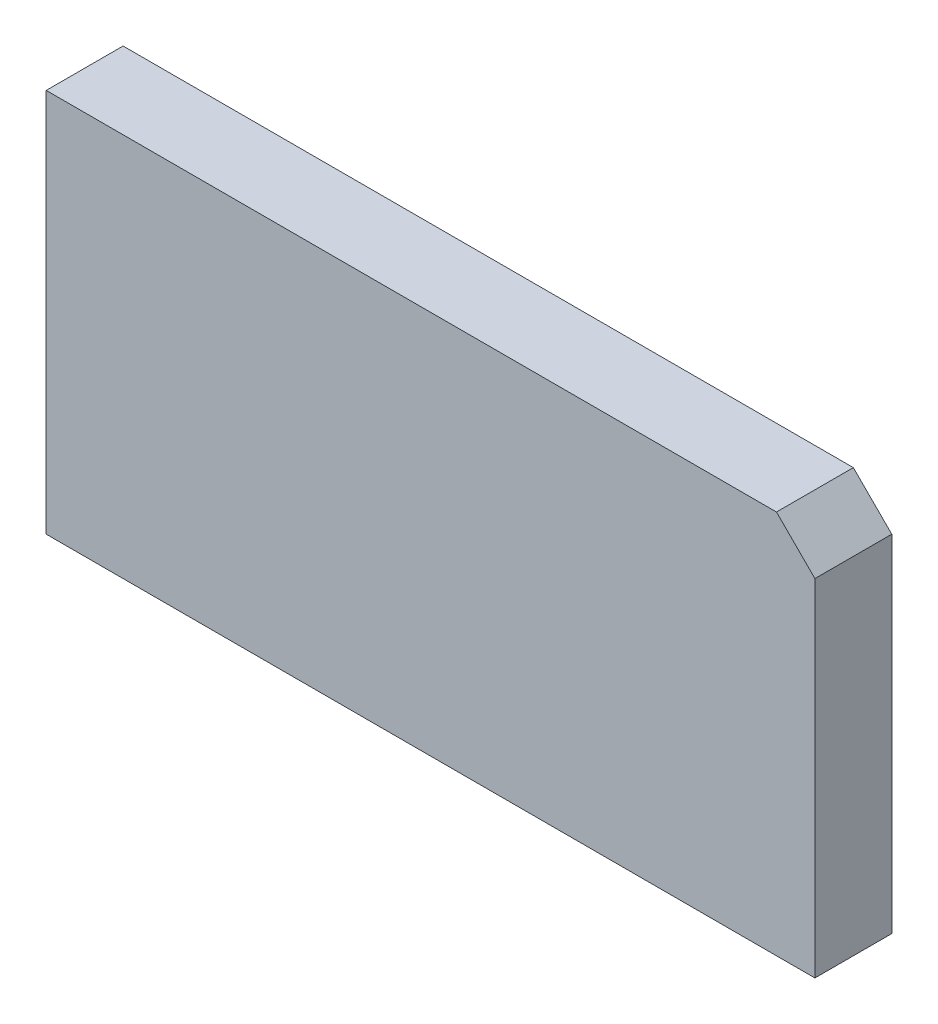
ISO-10303-21;
HEADER;
FILE_DESCRIPTION(('STEP AP214'),'2;1');
FILE_NAME('part.step','',(''),(''),'','','');
FILE_SCHEMA(('AUTOMOTIVE_DESIGN { 1 0 10303 214 1 1 1 1 }'));
ENDSEC;
DATA;
#1=APPLICATION_CONTEXT('core data for automotive mechanical design processes');
#2=APPLICATION_PROTOCOL_DEFINITION('international standard','automotive_design',2000,#1);
#3=PRODUCT_CONTEXT('',#1,'mechanical');
#4=PRODUCT('Part','Part','',(#3));
#5=PRODUCT_RELATED_PRODUCT_CATEGORY('part','',(#4));
#6=PRODUCT_DEFINITION_FORMATION('','',#4);
#7=PRODUCT_DEFINITION_CONTEXT('part definition',#1,'design');
#8=PRODUCT_DEFINITION('design','',#6,#7);
#9=PRODUCT_DEFINITION_SHAPE('','',#8);
#10=(LENGTH_UNIT() NAMED_UNIT(*) SI_UNIT(.MILLI.,.METRE.));
#11=(NAMED_UNIT(*) PLANE_ANGLE_UNIT() SI_UNIT($,.RADIAN.));
#12=(NAMED_UNIT(*) SI_UNIT($,.STERADIAN.) SOLID_ANGLE_UNIT());
#13=UNCERTAINTY_MEASURE_WITH_UNIT(LENGTH_MEASURE(1.E-05),#10,'distance_accuracy_value','');
#14=(GEOMETRIC_REPRESENTATION_CONTEXT(3) GLOBAL_UNCERTAINTY_ASSIGNED_CONTEXT((#13)) GLOBAL_UNIT_ASSIGNED_CONTEXT((#10,
#11,#12)) REPRESENTATION_CONTEXT('',''));
#15=CARTESIAN_POINT('',(0.,0.,0.));
#16=DIRECTION('',(0.,0.,1.));
#17=DIRECTION('',(1.,0.,0.));
#18=AXIS2_PLACEMENT_3D('',#15,#16,#17);
#19=CARTESIAN_POINT('',(-1000.,500.,-200.));
#20=DIRECTION('',(-1.,0.,0.));
#21=DIRECTION('',(0.,-1.,0.));
#22=AXIS2_PLACEMENT_3D('',#19,#20,#21);
#23=PLANE('',#22);
#24=DIRECTION('',(0.,-1.,0.));
#25=VECTOR('',#24,1.);
#26=CARTESIAN_POINT('',(-1000.,500.,0.));
#27=LINE('',#26,#25);
#28=CARTESIAN_POINT('',(-1000.,500.,0.));
#29=VERTEX_POINT('',#28);
#30=CARTESIAN_POINT('',(-1000.,-500.,0.));
#31=VERTEX_POINT('',#30);
#32=EDGE_CURVE('E120',#29,#31,#27,.T.);
#33=ORIENTED_EDGE('',*,*,#32,.F.);
#34=DIRECTION('',(0.,0.,1.));
#35=VECTOR('',#34,1.);
#36=CARTESIAN_POINT('',(-1000.,500.,-200.));
#37=LINE('',#36,#35);
#38=CARTESIAN_POINT('',(-1000.,500.,-200.));
#39=VERTEX_POINT('',#38);
#40=EDGE_CURVE('E11',#39,#29,#37,.T.);
#41=ORIENTED_EDGE('',*,*,#40,.F.);
#42=DIRECTION('',(0.,-1.,0.));
#43=VECTOR('',#42,1.);
#44=CARTESIAN_POINT('',(-1000.,500.,-200.));
#45=LINE('',#44,#43);
#46=CARTESIAN_POINT('',(-1000.,-500.,-200.));
#47=VERTEX_POINT('',#46);
#48=EDGE_CURVE('E110',#39,#47,#45,.T.);
#49=ORIENTED_EDGE('',*,*,#48,.T.);
#50=DIRECTION('',(0.,0.,1.));
#51=VECTOR('',#50,1.);
#52=CARTESIAN_POINT('',(-1000.,-500.,-200.));
#53=LINE('',#52,#51);
#54=EDGE_CURVE('E42',#47,#31,#53,.T.);
#55=ORIENTED_EDGE('',*,*,#54,.T.);
#56=EDGE_LOOP('',(#33,#41,#49,#55));
#57=FACE_BOUND('',#56,.T.);
#58=ADVANCED_FACE('F39',(#57),#23,.T.);
#59=CARTESIAN_POINT('',(-1000.,500.,-200.));
#60=DIRECTION('',(0.,1.,0.));
#61=DIRECTION('',(0.,0.,1.));
#62=AXIS2_PLACEMENT_3D('',#59,#60,#61);
#63=PLANE('',#62);
#64=DIRECTION('',(0.,0.,1.));
#65=VECTOR('',#64,1.);
#66=CARTESIAN_POINT('',(900.,500.,-200.));
#67=LINE('',#66,#65);
#68=CARTESIAN_POINT('',(900.,500.,-200.));
#69=VERTEX_POINT('',#68);
#70=CARTESIAN_POINT('',(900.,500.,0.));
#71=VERTEX_POINT('',#70);
#72=EDGE_CURVE('E56',#69,#71,#67,.T.);
#73=ORIENTED_EDGE('',*,*,#72,.F.);
#74=DIRECTION('',(-1.,0.,0.));
#75=VECTOR('',#74,1.);
#76=CARTESIAN_POINT('',(-1000.,500.,-200.));
#77=LINE('',#76,#75);
#78=EDGE_CURVE('E63',#69,#39,#77,.T.);
#79=ORIENTED_EDGE('',*,*,#78,.T.);
#80=ORIENTED_EDGE('',*,*,#40,.T.);
#81=DIRECTION('',(-1.,0.,0.));
#82=VECTOR('',#81,1.);
#83=CARTESIAN_POINT('',(-1000.,500.,0.));
#84=LINE('',#83,#82);
#85=EDGE_CURVE('E81',#71,#29,#84,.T.);
#86=ORIENTED_EDGE('',*,*,#85,.F.);
#87=EDGE_LOOP('',(#73,#79,#80,#86));
#88=FACE_BOUND('',#87,.T.);
#89=ADVANCED_FACE('F104',(#88),#63,.T.);
#90=CARTESIAN_POINT('',(1000.,500.,-200.));
#91=DIRECTION('',(1.,0.,0.));
#92=DIRECTION('',(0.,1.,0.));
#93=AXIS2_PLACEMENT_3D('',#90,#91,#92);
#94=PLANE('',#93);
#95=DIRECTION('',(0.,0.,1.));
#96=VECTOR('',#95,1.);
#97=CARTESIAN_POINT('',(1000.,400.,-200.));
#98=LINE('',#97,#96);
#99=CARTESIAN_POINT('',(1000.,400.,-200.));
#100=VERTEX_POINT('',#99);
#101=CARTESIAN_POINT('',(1000.,400.,0.));
#102=VERTEX_POINT('',#101);
#103=EDGE_CURVE('E97',#100,#102,#98,.T.);
#104=ORIENTED_EDGE('',*,*,#103,.T.);
#105=DIRECTION('',(0.,1.,0.));
#106=VECTOR('',#105,1.);
#107=CARTESIAN_POINT('',(1000.,500.,0.));
#108=LINE('',#107,#106);
#109=CARTESIAN_POINT('',(1000.,-500.,0.));
#110=VERTEX_POINT('',#109);
#111=EDGE_CURVE('E127',#110,#102,#108,.T.);
#112=ORIENTED_EDGE('',*,*,#111,.F.);
#113=DIRECTION('',(0.,0.,1.));
#114=VECTOR('',#113,1.);
#115=CARTESIAN_POINT('',(1000.,-500.,-200.));
#116=LINE('',#115,#114);
#117=CARTESIAN_POINT('',(1000.,-500.,-200.));
#118=VERTEX_POINT('',#117);
#119=EDGE_CURVE('E48',#118,#110,#116,.T.);
#120=ORIENTED_EDGE('',*,*,#119,.F.);
#121=DIRECTION('',(0.,1.,0.));
#122=VECTOR('',#121,1.);
#123=CARTESIAN_POINT('',(1000.,500.,-200.));
#124=LINE('',#123,#122);
#125=EDGE_CURVE('E112',#118,#100,#124,.T.);
#126=ORIENTED_EDGE('',*,*,#125,.T.);
#127=EDGE_LOOP('',(#104,#112,#120,#126));
#128=FACE_BOUND('',#127,.T.);
#129=ADVANCED_FACE('F136',(#128),#94,.T.);
#130=CARTESIAN_POINT('',(-1000.,-500.,-200.));
#131=DIRECTION('',(0.,-1.,0.));
#132=DIRECTION('',(0.,0.,-1.));
#133=AXIS2_PLACEMENT_3D('',#130,#131,#132);
#134=PLANE('',#133);
#135=DIRECTION('',(1.,0.,0.));
#136=VECTOR('',#135,1.);
#137=CARTESIAN_POINT('',(-1000.,-500.,0.));
#138=LINE('',#137,#136);
#139=EDGE_CURVE('E123',#31,#110,#138,.T.);
#140=ORIENTED_EDGE('',*,*,#139,.F.);
#141=ORIENTED_EDGE('',*,*,#54,.F.);
#142=DIRECTION('',(1.,0.,0.));
#143=VECTOR('',#142,1.);
#144=CARTESIAN_POINT('',(-1000.,-500.,-200.));
#145=LINE('',#144,#143);
#146=EDGE_CURVE('E116',#47,#118,#145,.T.);
#147=ORIENTED_EDGE('',*,*,#146,.T.);
#148=ORIENTED_EDGE('',*,*,#119,.T.);
#149=EDGE_LOOP('',(#140,#141,#147,#148));
#150=FACE_BOUND('',#149,.T.);
#151=ADVANCED_FACE('F134',(#150),#134,.T.);
#152=CARTESIAN_POINT('',(0.,0.,-200.));
#153=DIRECTION('',(0.,0.,1.));
#154=DIRECTION('',(1.,0.,0.));
#155=AXIS2_PLACEMENT_3D('',#152,#153,#154);
#156=PLANE('',#155);
#157=ORIENTED_EDGE('',*,*,#78,.F.);
#158=DIRECTION('',(0.707106781186548,-0.707106781186547,0.));
#159=VECTOR('',#158,1.);
#160=CARTESIAN_POINT('',(900.,500.,-200.));
#161=LINE('',#160,#159);
#162=EDGE_CURVE('E94',#69,#100,#161,.T.);
#163=ORIENTED_EDGE('',*,*,#162,.T.);
#164=ORIENTED_EDGE('',*,*,#125,.F.);
#165=ORIENTED_EDGE('',*,*,#146,.F.);
#166=ORIENTED_EDGE('',*,*,#48,.F.);
#167=EDGE_LOOP('',(#157,#163,#164,#165,#166));
#168=FACE_BOUND('',#167,.T.);
#169=ADVANCED_FACE('F108',(#168),#156,.F.);
#170=CARTESIAN_POINT('',(0.,0.,0.));
#171=DIRECTION('',(0.,0.,1.));
#172=DIRECTION('',(1.,0.,0.));
#173=AXIS2_PLACEMENT_3D('',#170,#171,#172);
#174=PLANE('',#173);
#175=DIRECTION('',(0.707106781186548,-0.707106781186547,0.));
#176=VECTOR('',#175,1.);
#177=CARTESIAN_POINT('',(900.,500.,0.));
#178=LINE('',#177,#176);
#179=EDGE_CURVE('E102',#71,#102,#178,.T.);
#180=ORIENTED_EDGE('',*,*,#179,.F.);
#181=ORIENTED_EDGE('',*,*,#85,.T.);
#182=ORIENTED_EDGE('',*,*,#32,.T.);
#183=ORIENTED_EDGE('',*,*,#139,.T.);
#184=ORIENTED_EDGE('',*,*,#111,.T.);
#185=EDGE_LOOP('',(#180,#181,#182,#183,#184));
#186=FACE_BOUND('',#185,.T.);
#187=ADVANCED_FACE('F137',(#186),#174,.T.);
#188=CARTESIAN_POINT('',(900.,500.,-200.));
#189=DIRECTION('',(-0.707106781186547,-0.707106781186548,0.));
#190=DIRECTION('',(0.707106781186548,-0.707106781186547,0.));
#191=AXIS2_PLACEMENT_3D('',#188,#189,#190);
#192=PLANE('',#191);
#193=ORIENTED_EDGE('',*,*,#179,.T.);
#194=ORIENTED_EDGE('',*,*,#103,.F.);
#195=ORIENTED_EDGE('',*,*,#162,.F.);
#196=ORIENTED_EDGE('',*,*,#72,.T.);
#197=EDGE_LOOP('',(#193,#194,#195,#196));
#198=FACE_BOUND('',#197,.T.);
#199=ADVANCED_FACE('F95',(#198),#192,.F.);
#200=CLOSED_SHELL('',(#58,#89,#129,#151,#169,#187,#199));
#201=MANIFOLD_SOLID_BREP('B2',#200);
#202=ADVANCED_BREP_SHAPE_REPRESENTATION('',(#18,#201),#14);
#203=SHAPE_DEFINITION_REPRESENTATION(#9,#202);
ENDSEC;
END-ISO-10303-21;
